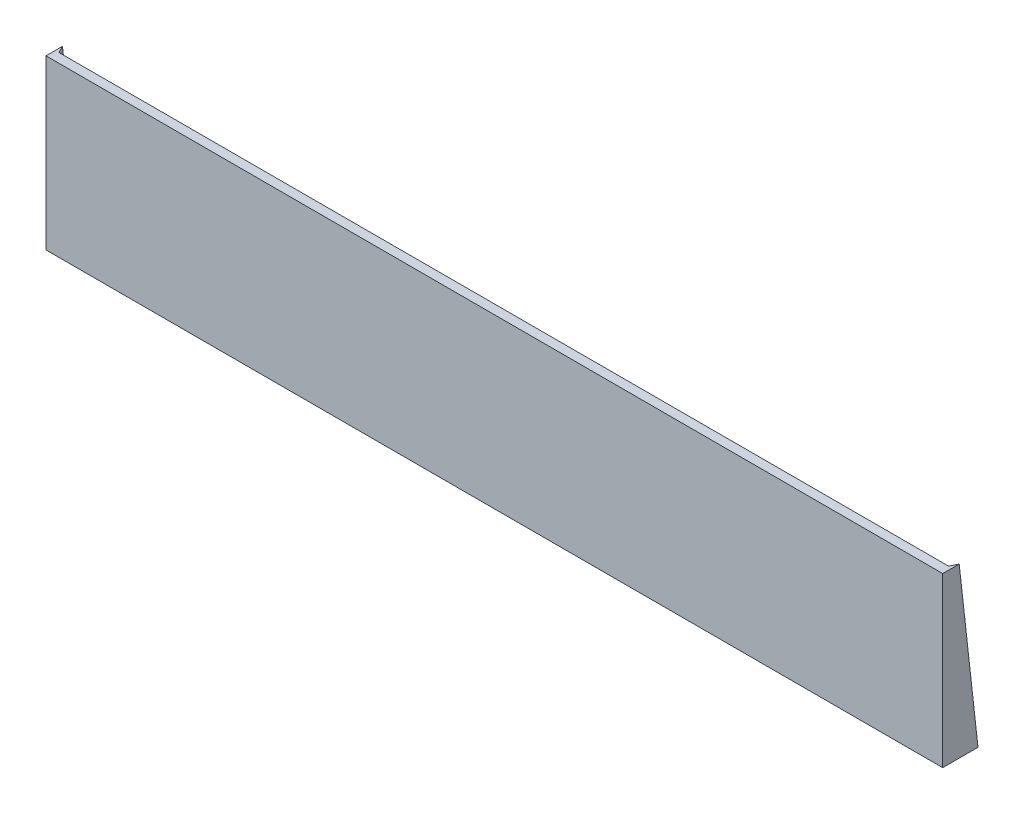
ISO-10303-21;
HEADER;
FILE_DESCRIPTION(('STEP AP214'),'2;1');
FILE_NAME('part.step','',(''),(''),'','','');
FILE_SCHEMA(('AUTOMOTIVE_DESIGN { 1 0 10303 214 1 1 1 1 }'));
ENDSEC;
DATA;
#1=APPLICATION_CONTEXT('core data for automotive mechanical design processes');
#2=APPLICATION_PROTOCOL_DEFINITION('international standard','automotive_design',2000,#1);
#3=PRODUCT_CONTEXT('',#1,'mechanical');
#4=PRODUCT('Part','Part','',(#3));
#5=PRODUCT_RELATED_PRODUCT_CATEGORY('part','',(#4));
#6=PRODUCT_DEFINITION_FORMATION('','',#4);
#7=PRODUCT_DEFINITION_CONTEXT('part definition',#1,'design');
#8=PRODUCT_DEFINITION('design','',#6,#7);
#9=PRODUCT_DEFINITION_SHAPE('','',#8);
#10=(LENGTH_UNIT() NAMED_UNIT(*) SI_UNIT(.MILLI.,.METRE.));
#11=(NAMED_UNIT(*) PLANE_ANGLE_UNIT() SI_UNIT($,.RADIAN.));
#12=(NAMED_UNIT(*) SI_UNIT($,.STERADIAN.) SOLID_ANGLE_UNIT());
#13=UNCERTAINTY_MEASURE_WITH_UNIT(LENGTH_MEASURE(1.E-05),#10,'distance_accuracy_value','');
#14=(GEOMETRIC_REPRESENTATION_CONTEXT(3) GLOBAL_UNCERTAINTY_ASSIGNED_CONTEXT((#13)) GLOBAL_UNIT_ASSIGNED_CONTEXT((#10,
#11,#12)) REPRESENTATION_CONTEXT('',''));
#15=CARTESIAN_POINT('',(0.,0.,0.));
#16=DIRECTION('',(0.,0.,1.));
#17=DIRECTION('',(1.,0.,0.));
#18=AXIS2_PLACEMENT_3D('',#15,#16,#17);
#19=CARTESIAN_POINT('',(-60.96,22.86,-5.08));
#20=DIRECTION('',(1.,0.,0.));
#21=DIRECTION('',(0.,0.,-1.));
#22=AXIS2_PLACEMENT_3D('',#19,#20,#21);
#23=PLANE('',#22);
#24=DIRECTION('',(0.,0.,1.));
#25=VECTOR('',#24,1.);
#26=CARTESIAN_POINT('',(-60.96,22.86,-5.08));
#27=LINE('',#26,#25);
#28=CARTESIAN_POINT('',(-60.96,22.86,-2.24019366857525));
#29=VERTEX_POINT('',#28);
#30=CARTESIAN_POINT('',(-60.96,22.86,0.));
#31=VERTEX_POINT('',#30);
#32=EDGE_CURVE('E84',#29,#31,#27,.T.);
#33=ORIENTED_EDGE('',*,*,#32,.F.);
#34=DIRECTION('',(0.,-0.993807989999906,-0.111111111111112));
#35=VECTOR('',#34,1.);
#36=CARTESIAN_POINT('',(-60.96,25.7504524357489,-1.91703126197203));
#37=LINE('',#36,#35);
#38=CARTESIAN_POINT('',(-60.96,0.,-4.79601936685755));
#39=VERTEX_POINT('',#38);
#40=EDGE_CURVE('E116',#29,#39,#37,.T.);
#41=ORIENTED_EDGE('',*,*,#40,.T.);
#42=DIRECTION('',(0.,0.,1.));
#43=VECTOR('',#42,1.);
#44=CARTESIAN_POINT('',(-60.96,0.,-5.08));
#45=LINE('',#44,#43);
#46=CARTESIAN_POINT('',(-60.96,0.,0.));
#47=VERTEX_POINT('',#46);
#48=EDGE_CURVE('E105',#39,#47,#45,.T.);
#49=ORIENTED_EDGE('',*,*,#48,.T.);
#50=DIRECTION('',(0.,-1.,0.));
#51=VECTOR('',#50,1.);
#52=CARTESIAN_POINT('',(-60.96,22.86,0.));
#53=LINE('',#52,#51);
#54=EDGE_CURVE('E99',#31,#47,#53,.T.);
#55=ORIENTED_EDGE('',*,*,#54,.F.);
#56=EDGE_LOOP('',(#33,#41,#49,#55));
#57=FACE_BOUND('',#56,.T.);
#58=ADVANCED_FACE('F32',(#57),#23,.F.);
#59=CARTESIAN_POINT('',(-60.96,22.86,0.));
#60=DIRECTION('',(0.,0.,-1.));
#61=DIRECTION('',(-1.,0.,0.));
#62=AXIS2_PLACEMENT_3D('',#59,#60,#61);
#63=PLANE('',#62);
#64=DIRECTION('',(1.,0.,0.));
#65=VECTOR('',#64,1.);
#66=CARTESIAN_POINT('',(-60.96,0.,0.));
#67=LINE('',#66,#65);
#68=CARTESIAN_POINT('',(60.96,0.,0.));
#69=VERTEX_POINT('',#68);
#70=EDGE_CURVE('E129',#47,#69,#67,.T.);
#71=ORIENTED_EDGE('',*,*,#70,.T.);
#72=DIRECTION('',(0.,-1.,0.));
#73=VECTOR('',#72,1.);
#74=CARTESIAN_POINT('',(60.96,22.86,0.));
#75=LINE('',#74,#73);
#76=CARTESIAN_POINT('',(60.96,22.86,0.));
#77=VERTEX_POINT('',#76);
#78=EDGE_CURVE('E101',#77,#69,#75,.T.);
#79=ORIENTED_EDGE('',*,*,#78,.F.);
#80=DIRECTION('',(1.,0.,0.));
#81=VECTOR('',#80,1.);
#82=CARTESIAN_POINT('',(-60.96,22.86,0.));
#83=LINE('',#82,#81);
#84=EDGE_CURVE('E88',#31,#77,#83,.T.);
#85=ORIENTED_EDGE('',*,*,#84,.F.);
#86=ORIENTED_EDGE('',*,*,#54,.T.);
#87=EDGE_LOOP('',(#71,#79,#85,#86));
#88=FACE_BOUND('',#87,.T.);
#89=ADVANCED_FACE('F98',(#88),#63,.F.);
#90=CARTESIAN_POINT('',(60.96,22.86,-5.08));
#91=DIRECTION('',(-1.,0.,0.));
#92=DIRECTION('',(0.,0.,1.));
#93=AXIS2_PLACEMENT_3D('',#90,#91,#92);
#94=PLANE('',#93);
#95=DIRECTION('',(0.,0.,-1.));
#96=VECTOR('',#95,1.);
#97=CARTESIAN_POINT('',(60.96,0.,-5.08));
#98=LINE('',#97,#96);
#99=CARTESIAN_POINT('',(60.96,0.,-4.79601936685752));
#100=VERTEX_POINT('',#99);
#101=EDGE_CURVE('E94',#69,#100,#98,.T.);
#102=ORIENTED_EDGE('',*,*,#101,.T.);
#103=DIRECTION('',(0.,0.993807989999906,0.111111111111112));
#104=VECTOR('',#103,1.);
#105=CARTESIAN_POINT('',(60.96,25.7504524357489,-1.91703126197203));
#106=LINE('',#105,#104);
#107=CARTESIAN_POINT('',(60.96,22.86,-2.24019366857525));
#108=VERTEX_POINT('',#107);
#109=EDGE_CURVE('E11',#100,#108,#106,.T.);
#110=ORIENTED_EDGE('',*,*,#109,.T.);
#111=DIRECTION('',(0.,0.,-1.));
#112=VECTOR('',#111,1.);
#113=CARTESIAN_POINT('',(60.96,22.86,-5.08));
#114=LINE('',#113,#112);
#115=EDGE_CURVE('E103',#77,#108,#114,.T.);
#116=ORIENTED_EDGE('',*,*,#115,.F.);
#117=ORIENTED_EDGE('',*,*,#78,.T.);
#118=EDGE_LOOP('',(#102,#110,#116,#117));
#119=FACE_BOUND('',#118,.T.);
#120=ADVANCED_FACE('F137',(#119),#94,.F.);
#121=CARTESIAN_POINT('',(0.,22.86,0.));
#122=DIRECTION('',(0.,1.,0.));
#123=DIRECTION('',(0.,0.,1.));
#124=AXIS2_PLACEMENT_3D('',#121,#122,#123);
#125=PLANE('',#124);
#126=DIRECTION('',(-1.,0.,0.));
#127=VECTOR('',#126,1.);
#128=CARTESIAN_POINT('',(-59.69,22.86,-1.27));
#129=LINE('',#128,#127);
#130=CARTESIAN_POINT('',(60.4749031657124,22.86,-1.27));
#131=VERTEX_POINT('',#130);
#132=CARTESIAN_POINT('',(-60.4749031657124,22.86,-1.27));
#133=VERTEX_POINT('',#132);
#134=EDGE_CURVE('E109',#131,#133,#129,.T.);
#135=ORIENTED_EDGE('',*,*,#134,.T.);
#136=DIRECTION('',(-0.447213595499958,0.,-0.894427190999916));
#137=VECTOR('',#136,1.);
#138=CARTESIAN_POINT('',(-62.0959225325699,22.86,-4.51203873371505));
#139=LINE('',#138,#137);
#140=EDGE_CURVE('E91',#133,#29,#139,.T.);
#141=ORIENTED_EDGE('',*,*,#140,.T.);
#142=ORIENTED_EDGE('',*,*,#32,.T.);
#143=ORIENTED_EDGE('',*,*,#84,.T.);
#144=ORIENTED_EDGE('',*,*,#115,.T.);
#145=DIRECTION('',(-0.447213595499958,0.,0.894427190999916));
#146=VECTOR('',#145,1.);
#147=CARTESIAN_POINT('',(60.8259225325699,22.86,-1.97203873371505));
#148=LINE('',#147,#146);
#149=EDGE_CURVE('E107',#108,#131,#148,.T.);
#150=ORIENTED_EDGE('',*,*,#149,.T.);
#151=EDGE_LOOP('',(#135,#141,#142,#143,#144,#150));
#152=FACE_BOUND('',#151,.T.);
#153=ADVANCED_FACE('F86',(#152),#125,.T.);
#154=CARTESIAN_POINT('',(0.,0.,0.));
#155=DIRECTION('',(0.,1.,0.));
#156=DIRECTION('',(0.,0.,1.));
#157=AXIS2_PLACEMENT_3D('',#154,#155,#156);
#158=PLANE('',#157);
#159=ORIENTED_EDGE('',*,*,#48,.F.);
#160=DIRECTION('',(0.447213595499958,0.,0.894427190999916));
#161=VECTOR('',#160,1.);
#162=CARTESIAN_POINT('',(-46.849592253257,0.,23.4247961266285));
#163=LINE('',#162,#161);
#164=CARTESIAN_POINT('',(-59.7684903165712,0.,-2.413));
#165=VERTEX_POINT('',#164);
#166=EDGE_CURVE('E41',#39,#165,#163,.T.);
#167=ORIENTED_EDGE('',*,*,#166,.T.);
#168=DIRECTION('',(1.,0.,0.));
#169=VECTOR('',#168,1.);
#170=CARTESIAN_POINT('',(0.,0.,-2.413));
#171=LINE('',#170,#169);
#172=CARTESIAN_POINT('',(59.7684903165712,0.,-2.41300000000001));
#173=VERTEX_POINT('',#172);
#174=EDGE_CURVE('E52',#165,#173,#171,.T.);
#175=ORIENTED_EDGE('',*,*,#174,.T.);
#176=DIRECTION('',(0.447213595499958,0.,-0.894427190999916));
#177=VECTOR('',#176,1.);
#178=CARTESIAN_POINT('',(46.849592253257,0.,23.4247961266285));
#179=LINE('',#178,#177);
#180=EDGE_CURVE('E118',#173,#100,#179,.T.);
#181=ORIENTED_EDGE('',*,*,#180,.T.);
#182=ORIENTED_EDGE('',*,*,#101,.F.);
#183=ORIENTED_EDGE('',*,*,#70,.F.);
#184=EDGE_LOOP('',(#159,#167,#175,#181,#182,#183));
#185=FACE_BOUND('',#184,.T.);
#186=ADVANCED_FACE('F142',(#185),#158,.F.);
#187=CARTESIAN_POINT('',(47.8719225325699,22.86,23.935961266285));
#188=DIRECTION('',(-0.893311248967107,0.0499376169438925,-0.446655624483554));
#189=DIRECTION('',(0.447213595499958,0.,-0.894427190999916));
#190=AXIS2_PLACEMENT_3D('',#187,#188,#189);
#191=PLANE('',#190);
#192=ORIENTED_EDGE('',*,*,#109,.F.);
#193=ORIENTED_EDGE('',*,*,#180,.F.);
#194=DIRECTION('',(-0.0308484559886455,-0.998277005801664,-0.0499138502900832));
#195=VECTOR('',#194,1.);
#196=CARTESIAN_POINT('',(60.5017210884166,23.7278462088632,-1.22660768955684));
#197=LINE('',#196,#195);
#198=EDGE_CURVE('E36',#131,#173,#197,.T.);
#199=ORIENTED_EDGE('',*,*,#198,.F.);
#200=ORIENTED_EDGE('',*,*,#149,.F.);
#201=EDGE_LOOP('',(#192,#193,#199,#200));
#202=FACE_BOUND('',#201,.T.);
#203=ADVANCED_FACE('F34',(#202),#191,.T.);
#204=CARTESIAN_POINT('',(0.,22.86,-1.27));
#205=DIRECTION('',(0.,0.0499376169438922,-0.998752338877845));
#206=DIRECTION('',(1.,0.,0.));
#207=AXIS2_PLACEMENT_3D('',#204,#205,#206);
#208=PLANE('',#207);
#209=ORIENTED_EDGE('',*,*,#198,.T.);
#210=ORIENTED_EDGE('',*,*,#174,.F.);
#211=DIRECTION('',(0.0308484559886455,-0.998277005801664,-0.0499138502900832));
#212=VECTOR('',#211,1.);
#213=CARTESIAN_POINT('',(-60.417353600712,20.9976569558324,-1.36311715220838));
#214=LINE('',#213,#212);
#215=EDGE_CURVE('E121',#133,#165,#214,.T.);
#216=ORIENTED_EDGE('',*,*,#215,.F.);
#217=ORIENTED_EDGE('',*,*,#134,.F.);
#218=EDGE_LOOP('',(#209,#210,#216,#217));
#219=FACE_BOUND('',#218,.T.);
#220=ADVANCED_FACE('F140',(#219),#208,.T.);
#221=CARTESIAN_POINT('',(-47.8719225325699,22.86,23.935961266285));
#222=DIRECTION('',(0.893311248967107,0.0499376169438925,-0.446655624483554));
#223=DIRECTION('',(0.447213595499958,0.,0.894427190999916));
#224=AXIS2_PLACEMENT_3D('',#221,#222,#223);
#225=PLANE('',#224);
#226=ORIENTED_EDGE('',*,*,#215,.T.);
#227=ORIENTED_EDGE('',*,*,#166,.F.);
#228=ORIENTED_EDGE('',*,*,#40,.F.);
#229=ORIENTED_EDGE('',*,*,#140,.F.);
#230=EDGE_LOOP('',(#226,#227,#228,#229));
#231=FACE_BOUND('',#230,.T.);
#232=ADVANCED_FACE('F141',(#231),#225,.T.);
#233=CLOSED_SHELL('',(#58,#89,#120,#153,#186,#203,#220,#232));
#234=MANIFOLD_SOLID_BREP('B2',#233);
#235=ADVANCED_BREP_SHAPE_REPRESENTATION('',(#18,#234),#14);
#236=SHAPE_DEFINITION_REPRESENTATION(#9,#235);
ENDSEC;
END-ISO-10303-21;
